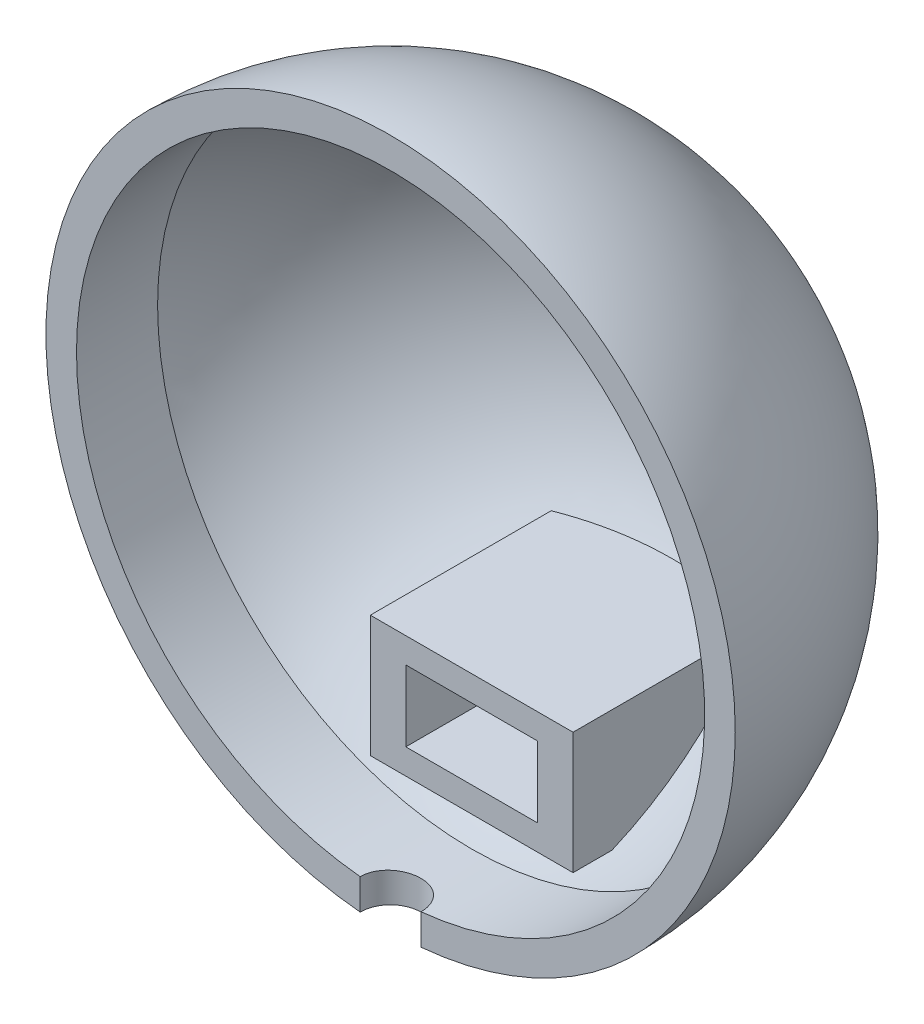
ISO-10303-21;
HEADER;
FILE_DESCRIPTION(('STEP AP214'),'2;1');
FILE_NAME('part.step','',(''),(''),'','','');
FILE_SCHEMA(('AUTOMOTIVE_DESIGN { 1 0 10303 214 1 1 1 1 }'));
ENDSEC;
DATA;
#1=APPLICATION_CONTEXT('core data for automotive mechanical design processes');
#2=APPLICATION_PROTOCOL_DEFINITION('international standard','automotive_design',2000,#1);
#3=PRODUCT_CONTEXT('',#1,'mechanical');
#4=PRODUCT('Part','Part','',(#3));
#5=PRODUCT_RELATED_PRODUCT_CATEGORY('part','',(#4));
#6=PRODUCT_DEFINITION_FORMATION('','',#4);
#7=PRODUCT_DEFINITION_CONTEXT('part definition',#1,'design');
#8=PRODUCT_DEFINITION('design','',#6,#7);
#9=PRODUCT_DEFINITION_SHAPE('','',#8);
#10=(LENGTH_UNIT() NAMED_UNIT(*) SI_UNIT(.MILLI.,.METRE.));
#11=(NAMED_UNIT(*) PLANE_ANGLE_UNIT() SI_UNIT($,.RADIAN.));
#12=(NAMED_UNIT(*) SI_UNIT($,.STERADIAN.) SOLID_ANGLE_UNIT());
#13=UNCERTAINTY_MEASURE_WITH_UNIT(LENGTH_MEASURE(1.E-05),#10,'distance_accuracy_value','');
#14=(GEOMETRIC_REPRESENTATION_CONTEXT(3) GLOBAL_UNCERTAINTY_ASSIGNED_CONTEXT((#13)) GLOBAL_UNIT_ASSIGNED_CONTEXT((#10,
#11,#12)) REPRESENTATION_CONTEXT('',''));
#15=CARTESIAN_POINT('',(0.,0.,0.));
#16=DIRECTION('',(0.,0.,1.));
#17=DIRECTION('',(1.,0.,0.));
#18=AXIS2_PLACEMENT_3D('',#15,#16,#17);
#19=CARTESIAN_POINT('',(0.,0.,0.));
#20=DIRECTION('',(0.,0.,-1.));
#21=DIRECTION('',(1.,0.,0.));
#22=AXIS2_PLACEMENT_3D('',#19,#20,#21);
#23=SPHERICAL_SURFACE('',#22,17.);
#24=CARTESIAN_POINT('',(0.,0.,-14.1512898661064));
#25=DIRECTION('',(0.,0.,1.));
#26=DIRECTION('',(1.,0.,0.));
#27=AXIS2_PLACEMENT_3D('',#24,#25,#26);
#28=CIRCLE('',#27,9.42024389946642);
#29=CARTESIAN_POINT('',(9.42024389946642,0.,-14.1512898661064));
#30=VERTEX_POINT('',#29);
#31=EDGE_CURVE('E170',#30,#30,#28,.T.);
#32=ORIENTED_EDGE('',*,*,#31,.T.);
#33=EDGE_LOOP('',(#32));
#34=FACE_BOUND('',#33,.T.);
#35=CARTESIAN_POINT('',(0.,0.,0.));
#36=DIRECTION('',(0.,0.,-1.));
#37=DIRECTION('',(-1.,0.,0.));
#38=AXIS2_PLACEMENT_3D('',#35,#36,#37);
#39=CIRCLE('',#38,17.);
#40=CARTESIAN_POINT('',(-1.5,-16.9336942218761,0.));
#41=VERTEX_POINT('',#40);
#42=CARTESIAN_POINT('',(1.5,-16.9336942218761,0.));
#43=VERTEX_POINT('',#42);
#44=EDGE_CURVE('E296',#41,#43,#39,.T.);
#45=ORIENTED_EDGE('',*,*,#44,.T.);
#46=CARTESIAN_POINT('',(0.,-16.9336942218761,0.));
#47=DIRECTION('',(0.,1.,0.));
#48=DIRECTION('',(0.,0.,1.));
#49=AXIS2_PLACEMENT_3D('',#46,#47,#48);
#50=CIRCLE('',#49,1.5);
#51=EDGE_CURVE('E209',#43,#41,#50,.T.);
#52=ORIENTED_EDGE('',*,*,#51,.T.);
#53=EDGE_LOOP('',(#45,#52));
#54=FACE_BOUND('',#53,.T.);
#55=ADVANCED_FACE('F65',(#34,#54),#23,.T.);
#56=CARTESIAN_POINT('',(0.,0.,0.));
#57=DIRECTION('',(0.,0.,-1.));
#58=DIRECTION('',(1.,0.,0.));
#59=AXIS2_PLACEMENT_3D('',#56,#57,#58);
#60=SPHERICAL_SURFACE('',#59,16.);
#61=CARTESIAN_POINT('',(5.,0.,0.));
#62=DIRECTION('',(1.,0.,0.));
#63=DIRECTION('',(0.,1.,0.));
#64=AXIS2_PLACEMENT_3D('',#61,#62,#63);
#65=CIRCLE('',#64,15.1986841535707);
#66=CARTESIAN_POINT('',(5.,-14.,-5.91607978309962));
#67=VERTEX_POINT('',#66);
#68=CARTESIAN_POINT('',(5.,-8.,-12.9228479833201));
#69=VERTEX_POINT('',#68);
#70=EDGE_CURVE('E187',#67,#69,#65,.T.);
#71=ORIENTED_EDGE('',*,*,#70,.F.);
#72=CARTESIAN_POINT('',(0.,-14.,0.));
#73=DIRECTION('',(0.,-1.,0.));
#74=DIRECTION('',(0.,0.,-1.));
#75=AXIS2_PLACEMENT_3D('',#72,#73,#74);
#76=CIRCLE('',#75,7.74596669241484);
#77=CARTESIAN_POINT('',(-5.,-14.,-5.91607978309962));
#78=VERTEX_POINT('',#77);
#79=EDGE_CURVE('E189',#78,#67,#76,.T.);
#80=ORIENTED_EDGE('',*,*,#79,.F.);
#81=CARTESIAN_POINT('',(-5.,0.,0.));
#82=DIRECTION('',(-1.,0.,0.));
#83=DIRECTION('',(0.,-1.,0.));
#84=AXIS2_PLACEMENT_3D('',#81,#82,#83);
#85=CIRCLE('',#84,15.1986841535707);
#86=CARTESIAN_POINT('',(-5.,-8.,-12.9228479833201));
#87=VERTEX_POINT('',#86);
#88=EDGE_CURVE('E191',#87,#78,#85,.T.);
#89=ORIENTED_EDGE('',*,*,#88,.F.);
#90=CARTESIAN_POINT('',(0.,-8.,0.));
#91=DIRECTION('',(0.,1.,0.));
#92=DIRECTION('',(0.,0.,1.));
#93=AXIS2_PLACEMENT_3D('',#90,#91,#92);
#94=CIRCLE('',#93,13.856406460551);
#95=EDGE_CURVE('E147',#69,#87,#94,.T.);
#96=ORIENTED_EDGE('',*,*,#95,.F.);
#97=EDGE_LOOP('',(#71,#80,#89,#96));
#98=FACE_BOUND('',#97,.T.);
#99=CARTESIAN_POINT('',(0.,0.,-4.));
#100=DIRECTION('',(0.,0.,-1.));
#101=DIRECTION('',(-1.,0.,0.));
#102=AXIS2_PLACEMENT_3D('',#99,#100,#101);
#103=CIRCLE('',#102,15.4919333848297);
#104=CARTESIAN_POINT('',(-15.4919333848297,0.,-4.));
#105=VERTEX_POINT('',#104);
#106=EDGE_CURVE('E289',#105,#105,#103,.T.);
#107=ORIENTED_EDGE('',*,*,#106,.F.);
#108=EDGE_LOOP('',(#107));
#109=FACE_BOUND('',#108,.T.);
#110=ADVANCED_FACE('F228',(#98,#109),#60,.F.);
#111=CARTESIAN_POINT('',(0.,0.,-17.));
#112=DIRECTION('',(0.,0.,-1.));
#113=DIRECTION('',(-1.,0.,0.));
#114=AXIS2_PLACEMENT_3D('',#111,#112,#113);
#115=CYLINDRICAL_SURFACE('',#114,15.4919333848297);
#116=CARTESIAN_POINT('',(0.,0.,0.));
#117=DIRECTION('',(0.,0.,-1.));
#118=DIRECTION('',(-1.,0.,0.));
#119=AXIS2_PLACEMENT_3D('',#116,#117,#118);
#120=CIRCLE('',#119,15.4919333848297);
#121=CARTESIAN_POINT('',(-1.5,-15.4191439451093,0.));
#122=VERTEX_POINT('',#121);
#123=CARTESIAN_POINT('',(1.5,-15.4191439451093,0.));
#124=VERTEX_POINT('',#123);
#125=EDGE_CURVE('E291',#122,#124,#120,.T.);
#126=ORIENTED_EDGE('',*,*,#125,.F.);
#127=CARTESIAN_POINT('',(-1.5,-15.4191439451093,0.));
#128=CARTESIAN_POINT('',(-1.49999983765005,-15.4191429624235,-0.0420958719238818));
#129=CARTESIAN_POINT('',(-1.49822682326132,-15.4193165540311,-0.084171479737501));
#130=CARTESIAN_POINT('',(-1.49115431963647,-15.4200025108564,-0.168019682399157));
#131=CARTESIAN_POINT('',(-1.48585506062743,-15.420514853957,-0.209792296849524));
#132=CARTESIAN_POINT('',(-1.46472162223399,-15.4225420663821,-0.334121900709567));
#133=CARTESIAN_POINT('',(-1.44365162184771,-15.4245471915048,-0.415842989772989));
#134=CARTESIAN_POINT('',(-1.38814881739143,-15.4296406322735,-0.574564139195647));
#135=CARTESIAN_POINT('',(-1.35371090818699,-15.4327293616989,-0.651562382900129));
#136=CARTESIAN_POINT('',(-1.2724599051644,-15.4396405988707,-0.798688236895952));
#137=CARTESIAN_POINT('',(-1.22564836097626,-15.4434630147163,-0.868816706027113));
#138=CARTESIAN_POINT('',(-1.12081379212078,-15.4514251601574,-1.00043860933495));
#139=CARTESIAN_POINT('',(-1.06275814750757,-15.4555657913092,-1.06190599837806));
#140=CARTESIAN_POINT('',(-0.937145202242762,-15.4636901277694,-1.1742484219798));
#141=CARTESIAN_POINT('',(-0.86958645741215,-15.4676738091083,-1.22512184366102));
#142=CARTESIAN_POINT('',(-0.726727999889681,-15.4750439148101,-1.31491362450828));
#143=CARTESIAN_POINT('',(-0.651413522679138,-15.4784291653945,-1.35380859726511));
#144=CARTESIAN_POINT('',(-0.495288857308607,-15.484210800457,-1.41838794191444));
#145=CARTESIAN_POINT('',(-0.414479127380867,-15.4866072672693,-1.44407341378096));
#146=CARTESIAN_POINT('',(-0.249922705232767,-15.4901351420538,-1.48143000873001));
#147=CARTESIAN_POINT('',(-0.166186024950801,-15.4912704961875,-1.49314485596836));
#148=CARTESIAN_POINT('',(0.00207421501945845,-15.49216164607,-1.5023629997785));
#149=CARTESIAN_POINT('',(0.0865977747235662,-15.4919174417912,-1.49986629606468));
#150=CARTESIAN_POINT('',(0.253731098354579,-15.4900801748905,-1.48076725002375));
#151=CARTESIAN_POINT('',(0.336346338612534,-15.4884916474048,-1.46421233307924));
#152=CARTESIAN_POINT('',(0.497619724058844,-15.4841495155166,-1.41754071087094));
#153=CARTESIAN_POINT('',(0.576277840218356,-15.4813959025685,-1.38742390613538));
#154=CARTESIAN_POINT('',(0.727555848756917,-15.4750253658788,-1.3144305925358));
#155=CARTESIAN_POINT('',(0.800165403386452,-15.4714070034053,-1.27153278955816));
#156=CARTESIAN_POINT('',(0.937168687468929,-15.4637133335454,-1.17421254811514));
#157=CARTESIAN_POINT('',(1.0015625597005,-15.4596380341025,-1.11979030997424));
#158=CARTESIAN_POINT('',(1.12057954630242,-15.4514685944638,-1.00070797977964));
#159=CARTESIAN_POINT('',(1.17516282385176,-15.4473744437427,-0.936008070666251));
#160=CARTESIAN_POINT('',(1.27271669127572,-15.4396436364305,-0.798317700002743));
#161=CARTESIAN_POINT('',(1.31568373965879,-15.4360071195404,-0.725324719718268));
#162=CARTESIAN_POINT('',(1.38878363864192,-15.4296024841808,-0.573080537627861));
#163=CARTESIAN_POINT('',(1.41890638532322,-15.4268350498208,-0.493824466861887));
#164=CARTESIAN_POINT('',(1.4653604055365,-15.4224924168436,-0.331405885240087));
#165=CARTESIAN_POINT('',(1.48171255291877,-15.420915414115,-0.248249489355108));
#166=CARTESIAN_POINT('',(1.49397632992533,-15.4197288578058,-0.137094018612691));
#167=CARTESIAN_POINT('',(1.496236332163,-15.419509652643,-0.109700128516638));
#168=CARTESIAN_POINT('',(1.49924612646356,-15.4192173775921,-0.0548746260563833));
#169=CARTESIAN_POINT('',(1.49999843693571,-15.419144064012,-0.0274431533161186));
#170=CARTESIAN_POINT('',(1.5,-15.4191439451093,0.));
#171=B_SPLINE_CURVE_WITH_KNOTS('',3,(#127,#128,#129,#130,#131,#132,#133,#134,#135,#136,#137,
#138,#139,#140,#141,#142,#143,#144,#145,#146,#147,#148,#149,#150,#151,#152,#153,#154,#155,#156,
#157,#158,#159,#160,#161,#162,#163,#164,#165,#166,#167,#168,#169,#170),.UNSPECIFIED.,.F.,.F.,(4,
2,2,2,2,2,2,2,2,2,2,2,2,2,2,2,2,2,2,2,2,4),(0.,0.126209737315243,0.252411235256196,
0.504363051949648,0.756411182536834,1.00842776245657,1.26118671864395,1.51398412800256,
1.76727200845091,2.0205387938388,2.2730108270428,2.52548286532077,2.77710655732468,
3.02873209493158,3.28077922667949,3.53282197755615,3.7858661227208,4.03898732780532,
4.29230728397011,4.5452425560934,4.62767607247528,4.70997177889625),.UNSPECIFIED.);
#172=EDGE_CURVE('E196',#122,#124,#171,.T.);
#173=ORIENTED_EDGE('',*,*,#172,.T.);
#174=EDGE_LOOP('',(#126,#173));
#175=FACE_BOUND('',#174,.T.);
#176=ORIENTED_EDGE('',*,*,#106,.T.);
#177=EDGE_LOOP('',(#176));
#178=FACE_BOUND('',#177,.T.);
#179=ADVANCED_FACE('F211',(#175,#178),#115,.F.);
#180=CARTESIAN_POINT('',(15.4919333848297,0.,0.));
#181=DIRECTION('',(0.,0.,-1.));
#182=DIRECTION('',(-1.,0.,0.));
#183=AXIS2_PLACEMENT_3D('',#180,#181,#182);
#184=PLANE('',#183);
#185=ORIENTED_EDGE('',*,*,#44,.F.);
#186=DIRECTION('',(0.,1.,0.));
#187=VECTOR('',#186,1.);
#188=CARTESIAN_POINT('',(-1.5,-17.,0.));
#189=LINE('',#188,#187);
#190=EDGE_CURVE('E12',#41,#122,#189,.T.);
#191=ORIENTED_EDGE('',*,*,#190,.T.);
#192=ORIENTED_EDGE('',*,*,#125,.T.);
#193=DIRECTION('',(0.,1.,0.));
#194=VECTOR('',#193,1.);
#195=CARTESIAN_POINT('',(1.5,-17.,0.));
#196=LINE('',#195,#194);
#197=EDGE_CURVE('E73',#124,#43,#196,.F.);
#198=ORIENTED_EDGE('',*,*,#197,.T.);
#199=EDGE_LOOP('',(#185,#191,#192,#198));
#200=FACE_BOUND('',#199,.T.);
#201=ADVANCED_FACE('F219',(#200),#184,.F.);
#202=CARTESIAN_POINT('',(0.,-17.,0.));
#203=DIRECTION('',(0.,1.,0.));
#204=DIRECTION('',(0.,0.,1.));
#205=AXIS2_PLACEMENT_3D('',#202,#203,#204);
#206=CYLINDRICAL_SURFACE('',#205,1.5);
#207=ORIENTED_EDGE('',*,*,#197,.F.);
#208=ORIENTED_EDGE('',*,*,#172,.F.);
#209=ORIENTED_EDGE('',*,*,#190,.F.);
#210=ORIENTED_EDGE('',*,*,#51,.F.);
#211=EDGE_LOOP('',(#207,#208,#209,#210));
#212=FACE_BOUND('',#211,.T.);
#213=ADVANCED_FACE('F214',(#212),#206,.F.);
#214=CARTESIAN_POINT('',(-5.,-14.,-17.002));
#215=DIRECTION('',(0.,-1.,0.));
#216=DIRECTION('',(0.,0.,-1.));
#217=AXIS2_PLACEMENT_3D('',#214,#215,#216);
#218=PLANE('',#217);
#219=DIRECTION('',(0.,0.,1.));
#220=VECTOR('',#219,1.);
#221=CARTESIAN_POINT('',(-5.,-14.,-17.002));
#222=LINE('',#221,#220);
#223=CARTESIAN_POINT('',(-5.,-14.,-4.));
#224=VERTEX_POINT('',#223);
#225=EDGE_CURVE('E164',#78,#224,#222,.T.);
#226=ORIENTED_EDGE('',*,*,#225,.F.);
#227=ORIENTED_EDGE('',*,*,#79,.T.);
#228=DIRECTION('',(0.,0.,1.));
#229=VECTOR('',#228,1.);
#230=CARTESIAN_POINT('',(5.,-14.,-17.002));
#231=LINE('',#230,#229);
#232=CARTESIAN_POINT('',(5.,-14.,-4.));
#233=VERTEX_POINT('',#232);
#234=EDGE_CURVE('E183',#67,#233,#231,.T.);
#235=ORIENTED_EDGE('',*,*,#234,.T.);
#236=DIRECTION('',(1.,0.,0.));
#237=VECTOR('',#236,1.);
#238=CARTESIAN_POINT('',(-5.,-14.,-4.));
#239=LINE('',#238,#237);
#240=EDGE_CURVE('E166',#224,#233,#239,.T.);
#241=ORIENTED_EDGE('',*,*,#240,.F.);
#242=EDGE_LOOP('',(#226,#227,#235,#241));
#243=FACE_BOUND('',#242,.T.);
#244=ADVANCED_FACE('F218',(#243),#218,.T.);
#245=CARTESIAN_POINT('',(-3.25,-9.25,-17.002));
#246=DIRECTION('',(0.,1.,0.));
#247=DIRECTION('',(0.,0.,1.));
#248=AXIS2_PLACEMENT_3D('',#245,#246,#247);
#249=PLANE('',#248);
#250=CARTESIAN_POINT('',(0.,-9.25,0.));
#251=DIRECTION('',(0.,1.,0.));
#252=DIRECTION('',(0.,0.,1.));
#253=AXIS2_PLACEMENT_3D('',#250,#251,#252);
#254=CIRCLE('',#253,13.0551713891469);
#255=CARTESIAN_POINT('',(3.25,-9.25,-12.6441686164018));
#256=VERTEX_POINT('',#255);
#257=CARTESIAN_POINT('',(-3.25,-9.25,-12.6441686164018));
#258=VERTEX_POINT('',#257);
#259=EDGE_CURVE('E198',#256,#258,#254,.T.);
#260=ORIENTED_EDGE('',*,*,#259,.F.);
#261=DIRECTION('',(0.,0.,1.));
#262=VECTOR('',#261,1.);
#263=CARTESIAN_POINT('',(3.25,-9.25,-17.002));
#264=LINE('',#263,#262);
#265=CARTESIAN_POINT('',(3.25,-9.25,-4.));
#266=VERTEX_POINT('',#265);
#267=EDGE_CURVE('E179',#256,#266,#264,.T.);
#268=ORIENTED_EDGE('',*,*,#267,.T.);
#269=DIRECTION('',(-1.,0.,0.));
#270=VECTOR('',#269,1.);
#271=CARTESIAN_POINT('',(-3.25,-9.25,-4.));
#272=LINE('',#271,#270);
#273=CARTESIAN_POINT('',(-3.25,-9.25,-4.));
#274=VERTEX_POINT('',#273);
#275=EDGE_CURVE('E160',#266,#274,#272,.T.);
#276=ORIENTED_EDGE('',*,*,#275,.T.);
#277=DIRECTION('',(0.,0.,1.));
#278=VECTOR('',#277,1.);
#279=CARTESIAN_POINT('',(-3.25,-9.25,-17.002));
#280=LINE('',#279,#278);
#281=EDGE_CURVE('E151',#258,#274,#280,.T.);
#282=ORIENTED_EDGE('',*,*,#281,.F.);
#283=EDGE_LOOP('',(#260,#268,#276,#282));
#284=FACE_BOUND('',#283,.T.);
#285=ADVANCED_FACE('F269',(#284),#249,.F.);
#286=CARTESIAN_POINT('',(3.25,-9.25,-17.002));
#287=DIRECTION('',(1.,0.,0.));
#288=DIRECTION('',(0.,1.,0.));
#289=AXIS2_PLACEMENT_3D('',#286,#287,#288);
#290=PLANE('',#289);
#291=CARTESIAN_POINT('',(3.25,0.,0.));
#292=DIRECTION('',(1.,0.,0.));
#293=DIRECTION('',(0.,1.,0.));
#294=AXIS2_PLACEMENT_3D('',#291,#292,#293);
#295=CIRCLE('',#294,15.6664450338933);
#296=CARTESIAN_POINT('',(3.25,-12.75,-9.10357072801656));
#297=VERTEX_POINT('',#296);
#298=EDGE_CURVE('E89',#297,#256,#295,.T.);
#299=ORIENTED_EDGE('',*,*,#298,.F.);
#300=DIRECTION('',(0.,0.,1.));
#301=VECTOR('',#300,1.);
#302=CARTESIAN_POINT('',(3.25,-12.75,-17.002));
#303=LINE('',#302,#301);
#304=CARTESIAN_POINT('',(3.25,-12.75,-4.));
#305=VERTEX_POINT('',#304);
#306=EDGE_CURVE('E176',#297,#305,#303,.T.);
#307=ORIENTED_EDGE('',*,*,#306,.T.);
#308=DIRECTION('',(0.,1.,0.));
#309=VECTOR('',#308,1.);
#310=CARTESIAN_POINT('',(3.25,-9.25,-4.));
#311=LINE('',#310,#309);
#312=EDGE_CURVE('E405',#305,#266,#311,.T.);
#313=ORIENTED_EDGE('',*,*,#312,.T.);
#314=ORIENTED_EDGE('',*,*,#267,.F.);
#315=EDGE_LOOP('',(#299,#307,#313,#314));
#316=FACE_BOUND('',#315,.T.);
#317=ADVANCED_FACE('F258',(#316),#290,.F.);
#318=CARTESIAN_POINT('',(0.,0.,-4.));
#319=DIRECTION('',(0.,0.,1.));
#320=DIRECTION('',(1.,0.,0.));
#321=AXIS2_PLACEMENT_3D('',#318,#319,#320);
#322=PLANE('',#321);
#323=DIRECTION('',(0.,-1.,0.));
#324=VECTOR('',#323,1.);
#325=CARTESIAN_POINT('',(-3.25,-9.25,-4.));
#326=LINE('',#325,#324);
#327=CARTESIAN_POINT('',(-3.25,-12.75,-4.));
#328=VERTEX_POINT('',#327);
#329=EDGE_CURVE('E177',#274,#328,#326,.T.);
#330=ORIENTED_EDGE('',*,*,#329,.F.);
#331=ORIENTED_EDGE('',*,*,#275,.F.);
#332=ORIENTED_EDGE('',*,*,#312,.F.);
#333=DIRECTION('',(1.,0.,0.));
#334=VECTOR('',#333,1.);
#335=CARTESIAN_POINT('',(-3.25,-12.75,-4.));
#336=LINE('',#335,#334);
#337=EDGE_CURVE('E409',#328,#305,#336,.T.);
#338=ORIENTED_EDGE('',*,*,#337,.F.);
#339=EDGE_LOOP('',(#330,#331,#332,#338));
#340=FACE_BOUND('',#339,.T.);
#341=DIRECTION('',(0.,-1.,0.));
#342=VECTOR('',#341,1.);
#343=CARTESIAN_POINT('',(-5.,-8.,-4.));
#344=LINE('',#343,#342);
#345=CARTESIAN_POINT('',(-5.,-8.,-4.));
#346=VERTEX_POINT('',#345);
#347=EDGE_CURVE('E157',#346,#224,#344,.T.);
#348=ORIENTED_EDGE('',*,*,#347,.T.);
#349=ORIENTED_EDGE('',*,*,#240,.T.);
#350=DIRECTION('',(0.,1.,0.));
#351=VECTOR('',#350,1.);
#352=CARTESIAN_POINT('',(5.,-8.,-4.));
#353=LINE('',#352,#351);
#354=CARTESIAN_POINT('',(5.,-8.,-4.));
#355=VERTEX_POINT('',#354);
#356=EDGE_CURVE('E159',#233,#355,#353,.T.);
#357=ORIENTED_EDGE('',*,*,#356,.T.);
#358=DIRECTION('',(-1.,0.,0.));
#359=VECTOR('',#358,1.);
#360=CARTESIAN_POINT('',(-5.,-8.,-4.));
#361=LINE('',#360,#359);
#362=EDGE_CURVE('E144',#355,#346,#361,.T.);
#363=ORIENTED_EDGE('',*,*,#362,.T.);
#364=EDGE_LOOP('',(#348,#349,#357,#363));
#365=FACE_BOUND('',#364,.T.);
#366=ADVANCED_FACE('F155',(#340,#365),#322,.T.);
#367=CARTESIAN_POINT('',(-5.,-8.,-17.002));
#368=DIRECTION('',(-1.,0.,0.));
#369=DIRECTION('',(0.,-1.,0.));
#370=AXIS2_PLACEMENT_3D('',#367,#368,#369);
#371=PLANE('',#370);
#372=DIRECTION('',(0.,0.,1.));
#373=VECTOR('',#372,1.);
#374=CARTESIAN_POINT('',(-5.,-8.,-17.002));
#375=LINE('',#374,#373);
#376=EDGE_CURVE('E141',#87,#346,#375,.T.);
#377=ORIENTED_EDGE('',*,*,#376,.F.);
#378=ORIENTED_EDGE('',*,*,#88,.T.);
#379=ORIENTED_EDGE('',*,*,#225,.T.);
#380=ORIENTED_EDGE('',*,*,#347,.F.);
#381=EDGE_LOOP('',(#377,#378,#379,#380));
#382=FACE_BOUND('',#381,.T.);
#383=ADVANCED_FACE('F162',(#382),#371,.T.);
#384=CARTESIAN_POINT('',(5.,-8.,-17.002));
#385=DIRECTION('',(1.,0.,0.));
#386=DIRECTION('',(0.,1.,0.));
#387=AXIS2_PLACEMENT_3D('',#384,#385,#386);
#388=PLANE('',#387);
#389=ORIENTED_EDGE('',*,*,#234,.F.);
#390=ORIENTED_EDGE('',*,*,#70,.T.);
#391=DIRECTION('',(0.,0.,1.));
#392=VECTOR('',#391,1.);
#393=CARTESIAN_POINT('',(5.,-8.,-17.002));
#394=LINE('',#393,#392);
#395=EDGE_CURVE('E81',#69,#355,#394,.T.);
#396=ORIENTED_EDGE('',*,*,#395,.T.);
#397=ORIENTED_EDGE('',*,*,#356,.F.);
#398=EDGE_LOOP('',(#389,#390,#396,#397));
#399=FACE_BOUND('',#398,.T.);
#400=ADVANCED_FACE('F276',(#399),#388,.T.);
#401=CARTESIAN_POINT('',(-5.,-8.,-17.002));
#402=DIRECTION('',(0.,1.,0.));
#403=DIRECTION('',(0.,0.,1.));
#404=AXIS2_PLACEMENT_3D('',#401,#402,#403);
#405=PLANE('',#404);
#406=ORIENTED_EDGE('',*,*,#395,.F.);
#407=ORIENTED_EDGE('',*,*,#95,.T.);
#408=ORIENTED_EDGE('',*,*,#376,.T.);
#409=ORIENTED_EDGE('',*,*,#362,.F.);
#410=EDGE_LOOP('',(#406,#407,#408,#409));
#411=FACE_BOUND('',#410,.T.);
#412=ADVANCED_FACE('F143',(#411),#405,.T.);
#413=CARTESIAN_POINT('',(-3.25,-9.25,-17.002));
#414=DIRECTION('',(-1.,0.,0.));
#415=DIRECTION('',(0.,-1.,0.));
#416=AXIS2_PLACEMENT_3D('',#413,#414,#415);
#417=PLANE('',#416);
#418=CARTESIAN_POINT('',(-3.25,0.,0.));
#419=DIRECTION('',(-1.,0.,0.));
#420=DIRECTION('',(0.,-1.,0.));
#421=AXIS2_PLACEMENT_3D('',#418,#419,#420);
#422=CIRCLE('',#421,15.6664450338933);
#423=CARTESIAN_POINT('',(-3.25,-12.75,-9.10357072801656));
#424=VERTEX_POINT('',#423);
#425=EDGE_CURVE('E193',#258,#424,#422,.T.);
#426=ORIENTED_EDGE('',*,*,#425,.F.);
#427=ORIENTED_EDGE('',*,*,#281,.T.);
#428=ORIENTED_EDGE('',*,*,#329,.T.);
#429=DIRECTION('',(0.,0.,1.));
#430=VECTOR('',#429,1.);
#431=CARTESIAN_POINT('',(-3.25,-12.75,-17.002));
#432=LINE('',#431,#430);
#433=EDGE_CURVE('E174',#424,#328,#432,.T.);
#434=ORIENTED_EDGE('',*,*,#433,.F.);
#435=EDGE_LOOP('',(#426,#427,#428,#434));
#436=FACE_BOUND('',#435,.T.);
#437=ADVANCED_FACE('F260',(#436),#417,.F.);
#438=CARTESIAN_POINT('',(-3.25,-12.75,-17.002));
#439=DIRECTION('',(0.,-1.,0.));
#440=DIRECTION('',(1.,0.,0.));
#441=AXIS2_PLACEMENT_3D('',#438,#439,#440);
#442=PLANE('',#441);
#443=CARTESIAN_POINT('',(0.,-12.75,0.));
#444=DIRECTION('',(0.,-1.,0.));
#445=DIRECTION('',(1.,0.,0.));
#446=AXIS2_PLACEMENT_3D('',#443,#444,#445);
#447=CIRCLE('',#446,9.6663074645906);
#448=EDGE_CURVE('E194',#424,#297,#447,.T.);
#449=ORIENTED_EDGE('',*,*,#448,.F.);
#450=ORIENTED_EDGE('',*,*,#433,.T.);
#451=ORIENTED_EDGE('',*,*,#337,.T.);
#452=ORIENTED_EDGE('',*,*,#306,.F.);
#453=EDGE_LOOP('',(#449,#450,#451,#452));
#454=FACE_BOUND('',#453,.T.);
#455=ADVANCED_FACE('F221',(#454),#442,.F.);
#456=ORIENTED_EDGE('',*,*,#259,.T.);
#457=ORIENTED_EDGE('',*,*,#425,.T.);
#458=ORIENTED_EDGE('',*,*,#448,.T.);
#459=ORIENTED_EDGE('',*,*,#298,.T.);
#460=EDGE_LOOP('',(#456,#457,#458,#459));
#461=FACE_BOUND('',#460,.T.);
#462=ADVANCED_FACE('F240',(#461),#60,.F.);
#463=CARTESIAN_POINT('',(0.,0.,-14.422205101856));
#464=DIRECTION('',(0.,0.,1.));
#465=DIRECTION('',(1.,0.,0.));
#466=AXIS2_PLACEMENT_3D('',#463,#464,#465);
#467=TOROIDAL_SURFACE('',#466,9.,0.500000000000003);
#468=ORIENTED_EDGE('',*,*,#31,.F.);
#469=EDGE_LOOP('',(#468));
#470=FACE_BOUND('',#469,.T.);
#471=CARTESIAN_POINT('',(0.,0.,-14.6806443816351));
#472=DIRECTION('',(0.,0.,-1.));
#473=DIRECTION('',(-1.,0.,0.));
#474=AXIS2_PLACEMENT_3D('',#471,#472,#473);
#475=CIRCLE('',#474,8.57197063340555);
#476=CARTESIAN_POINT('',(-8.57197063340555,0.,-14.6806443816351));
#477=VERTEX_POINT('',#476);
#478=EDGE_CURVE('E68',#477,#477,#475,.T.);
#479=ORIENTED_EDGE('',*,*,#478,.F.);
#480=EDGE_LOOP('',(#479));
#481=FACE_BOUND('',#480,.T.);
#482=ADVANCED_FACE('F244',(#470,#481),#467,.F.);
#483=ORIENTED_EDGE('',*,*,#478,.T.);
#484=EDGE_LOOP('',(#483));
#485=FACE_BOUND('',#484,.T.);
#486=ADVANCED_FACE('F233',(#485),#23,.T.);
#487=CLOSED_SHELL('',(#55,#110,#179,#201,#213,#244,#285,#317,#366,#383,#400,#412,#437,#455,#462,
#482,#486));
#488=MANIFOLD_SOLID_BREP('B2',#487);
#489=ADVANCED_BREP_SHAPE_REPRESENTATION('',(#18,#488),#14);
#490=SHAPE_DEFINITION_REPRESENTATION(#9,#489);
ENDSEC;
END-ISO-10303-21;
